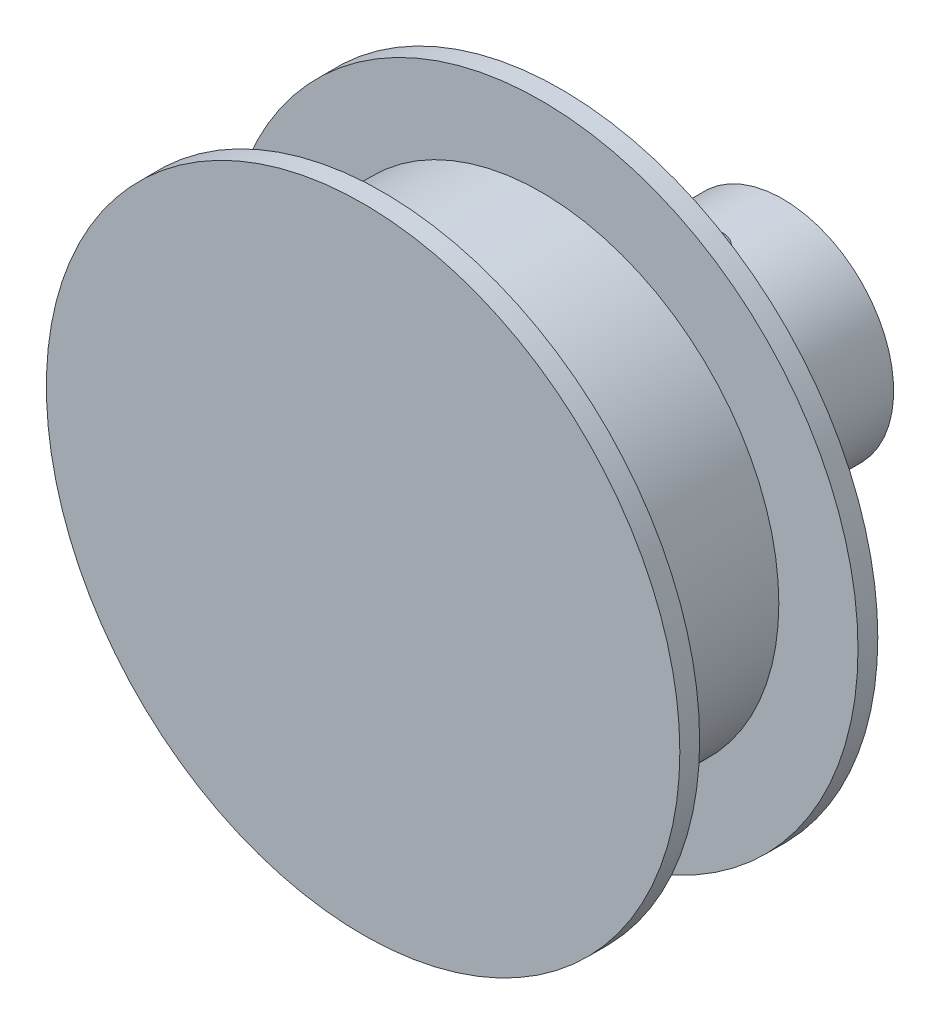
ISO-10303-21;
HEADER;
FILE_DESCRIPTION(('STEP AP214'),'2;1');
FILE_NAME('part.step','',(''),(''),'','','');
FILE_SCHEMA(('AUTOMOTIVE_DESIGN { 1 0 10303 214 1 1 1 1 }'));
ENDSEC;
DATA;
#1=APPLICATION_CONTEXT('core data for automotive mechanical design processes');
#2=APPLICATION_PROTOCOL_DEFINITION('international standard','automotive_design',2000,#1);
#3=PRODUCT_CONTEXT('',#1,'mechanical');
#4=PRODUCT('Part','Part','',(#3));
#5=PRODUCT_RELATED_PRODUCT_CATEGORY('part','',(#4));
#6=PRODUCT_DEFINITION_FORMATION('','',#4);
#7=PRODUCT_DEFINITION_CONTEXT('part definition',#1,'design');
#8=PRODUCT_DEFINITION('design','',#6,#7);
#9=PRODUCT_DEFINITION_SHAPE('','',#8);
#10=(LENGTH_UNIT() NAMED_UNIT(*) SI_UNIT(.MILLI.,.METRE.));
#11=(NAMED_UNIT(*) PLANE_ANGLE_UNIT() SI_UNIT($,.RADIAN.));
#12=(NAMED_UNIT(*) SI_UNIT($,.STERADIAN.) SOLID_ANGLE_UNIT());
#13=UNCERTAINTY_MEASURE_WITH_UNIT(LENGTH_MEASURE(1.E-05),#10,'distance_accuracy_value','');
#14=(GEOMETRIC_REPRESENTATION_CONTEXT(3) GLOBAL_UNCERTAINTY_ASSIGNED_CONTEXT((#13)) GLOBAL_UNIT_ASSIGNED_CONTEXT((#10,
#11,#12)) REPRESENTATION_CONTEXT('',''));
#15=CARTESIAN_POINT('',(0.,0.,0.));
#16=DIRECTION('',(0.,0.,1.));
#17=DIRECTION('',(1.,0.,0.));
#18=AXIS2_PLACEMENT_3D('',#15,#16,#17);
#19=CARTESIAN_POINT('',(0.,0.,-8.89));
#20=DIRECTION('',(0.,0.,1.));
#21=DIRECTION('',(1.,0.,0.));
#22=AXIS2_PLACEMENT_3D('',#19,#20,#21);
#23=CYLINDRICAL_SURFACE('',#22,4.445);
#24=CARTESIAN_POINT('',(0.,0.,-8.89));
#25=DIRECTION('',(0.,0.,-1.));
#26=DIRECTION('',(-1.,0.,0.));
#27=AXIS2_PLACEMENT_3D('',#24,#25,#26);
#28=CIRCLE('',#27,4.445);
#29=CARTESIAN_POINT('',(-4.445,0.,-8.89));
#30=VERTEX_POINT('',#29);
#31=EDGE_CURVE('E67',#30,#30,#28,.T.);
#32=ORIENTED_EDGE('',*,*,#31,.F.);
#33=EDGE_LOOP('',(#32));
#34=FACE_BOUND('',#33,.T.);
#35=CARTESIAN_POINT('',(0.,0.,0.));
#36=DIRECTION('',(0.,0.,-1.));
#37=DIRECTION('',(-1.,0.,0.));
#38=AXIS2_PLACEMENT_3D('',#35,#36,#37);
#39=CIRCLE('',#38,4.445);
#40=CARTESIAN_POINT('',(-4.445,0.,0.));
#41=VERTEX_POINT('',#40);
#42=EDGE_CURVE('E10',#41,#41,#39,.T.);
#43=ORIENTED_EDGE('',*,*,#42,.T.);
#44=EDGE_LOOP('',(#43));
#45=FACE_BOUND('',#44,.T.);
#46=CARTESIAN_POINT('',(0.,-4.445,-6.5024));
#47=CARTESIAN_POINT('',(0.043860784437337,-4.44499922419404,-6.50239827985609));
#48=CARTESIAN_POINT('',(0.0877444679366596,-4.44434407597419,-6.4987228312152));
#49=CARTESIAN_POINT('',(0.174278189480176,-4.44179367534173,-6.48412589665578));
#50=CARTESIAN_POINT('',(0.216927103954973,-4.43989732838557,-6.47319801510449));
#51=CARTESIAN_POINT('',(0.299727047662896,-4.4350769525841,-6.44443887937645));
#52=CARTESIAN_POINT('',(0.339880190238068,-4.43215380754623,-6.42661356077203));
#53=CARTESIAN_POINT('',(0.416621349264358,-4.42560016399602,-6.38458174064237));
#54=CARTESIAN_POINT('',(0.453209714375536,-4.42196973476541,-6.36037586403998));
#55=CARTESIAN_POINT('',(0.522180215516495,-4.4143595161333,-6.30599370007167));
#56=CARTESIAN_POINT('',(0.554518503767721,-4.41037670198772,-6.27576221993163));
#57=CARTESIAN_POINT('',(0.613691844178732,-4.40253340674175,-6.21030578118043));
#58=CARTESIAN_POINT('',(0.640526526203066,-4.39867293388397,-6.17508048698826));
#59=CARTESIAN_POINT('',(0.688109914213216,-4.39148208563801,-6.10033085720609));
#60=CARTESIAN_POINT('',(0.708814648600973,-4.3881556150554,-6.06077812205337));
#61=CARTESIAN_POINT('',(0.743269076192993,-4.3824517104805,-5.97868713228751));
#62=CARTESIAN_POINT('',(0.757019302200786,-4.3800742037885,-5.93614910666991));
#63=CARTESIAN_POINT('',(0.777034972321156,-4.37656770234049,-5.84976202912438));
#64=CARTESIAN_POINT('',(0.783376501559443,-4.37542602508096,-5.80593113067987));
#65=CARTESIAN_POINT('',(0.788630797019795,-4.37448214923508,-5.71781369991042));
#66=CARTESIAN_POINT('',(0.787544157269151,-4.37467984353977,-5.67352720430219));
#67=CARTESIAN_POINT('',(0.778034797553479,-4.37638080995529,-5.58630277668901));
#68=CARTESIAN_POINT('',(0.769698056646965,-4.37786878006914,-5.54335512894592));
#69=CARTESIAN_POINT('',(0.746060306038914,-4.38195864911965,-5.45947789437466));
#70=CARTESIAN_POINT('',(0.730759029420811,-4.38456059074916,-5.4185483849585));
#71=CARTESIAN_POINT('',(0.693540898768382,-4.39060149921825,-5.33961472176041));
#72=CARTESIAN_POINT('',(0.671588824862036,-4.39404490283999,-5.3016275280967));
#73=CARTESIAN_POINT('',(0.621717195694813,-4.40137774408315,-5.22984335314436));
#74=CARTESIAN_POINT('',(0.593797097996176,-4.4052672222337,-5.19604675318314));
#75=CARTESIAN_POINT('',(0.532315903757191,-4.41312093158066,-5.13310588353736));
#76=CARTESIAN_POINT('',(0.498681148128465,-4.41708544587114,-5.10403355208049));
#77=CARTESIAN_POINT('',(0.426973228116419,-4.42459222165068,-5.05193386759074));
#78=CARTESIAN_POINT('',(0.388900027829352,-4.42813447972354,-5.02890656346258));
#79=CARTESIAN_POINT('',(0.309324724750202,-4.43440365517576,-4.9895420784749));
#80=CARTESIAN_POINT('',(0.267819135656451,-4.4371297302425,-4.97321180266467));
#81=CARTESIAN_POINT('',(0.182595119635691,-4.44145275793028,-4.94777459941377));
#82=CARTESIAN_POINT('',(0.1388769025818,-4.44304981742688,-4.93866698824679));
#83=CARTESIAN_POINT('',(0.0510881145359754,-4.44492034664658,-4.92803244070224));
#84=CARTESIAN_POINT('',(0.00702984994213987,-4.44521104166531,-4.92640684198202));
#85=CARTESIAN_POINT('',(-0.0807291985336589,-4.44448346411101,-4.93051863784099));
#86=CARTESIAN_POINT('',(-0.124429997938574,-4.44346524868446,-4.93625571096899));
#87=CARTESIAN_POINT('',(-0.209924854488727,-4.44024495039647,-4.95484794416592));
#88=CARTESIAN_POINT('',(-0.251729984864177,-4.43805108222015,-4.96765373117759));
#89=CARTESIAN_POINT('',(-0.332599980273892,-4.43272444714496,-4.99996686118535));
#90=CARTESIAN_POINT('',(-0.371664675103964,-4.42959162199253,-5.01947461998754));
#91=CARTESIAN_POINT('',(-0.446369804483423,-4.42269168576044,-5.06486018569718));
#92=CARTESIAN_POINT('',(-0.481972634164526,-4.41891861921531,-5.09079896724435));
#93=CARTESIAN_POINT('',(-0.548355496344193,-4.41117333639321,-5.14822706850107));
#94=CARTESIAN_POINT('',(-0.579135129586692,-4.4072011036655,-5.17971684725482));
#95=CARTESIAN_POINT('',(-0.635368107794538,-4.39944877276715,-5.24779764789606));
#96=CARTESIAN_POINT('',(-0.660754456642331,-4.39567148827441,-5.28444437909867));
#97=CARTESIAN_POINT('',(-0.705010813945073,-4.38879122878618,-5.36154014549702));
#98=CARTESIAN_POINT('',(-0.723881047410447,-4.38568823050803,-5.40198904933713));
#99=CARTESIAN_POINT('',(-0.754471848169014,-4.38052946619188,-5.48536207847031));
#100=CARTESIAN_POINT('',(-0.766224469718678,-4.378469012055,-5.52827413917339));
#101=CARTESIAN_POINT('',(-0.782346375616618,-4.37561736758105,-5.61550326028159));
#102=CARTESIAN_POINT('',(-0.786716394172981,-4.37482605102723,-5.65982018052523));
#103=CARTESIAN_POINT('',(-0.787926555435724,-4.37460819292187,-5.74793104941419));
#104=CARTESIAN_POINT('',(-0.784872255092845,-4.37516251923527,-5.79172353628641));
#105=CARTESIAN_POINT('',(-0.771550121146633,-4.37753131700356,-5.87816065815361));
#106=CARTESIAN_POINT('',(-0.761282320096387,-4.37934578277171,-5.92080529832769));
#107=CARTESIAN_POINT('',(-0.733867121047589,-4.38402275642772,-6.00368756518297));
#108=CARTESIAN_POINT('',(-0.71672996052775,-4.38688370417992,-6.04392867178754));
#109=CARTESIAN_POINT('',(-0.676073665698779,-4.39333258364465,-6.12098159403416));
#110=CARTESIAN_POINT('',(-0.652554148383913,-4.39692055898288,-6.15779320369369));
#111=CARTESIAN_POINT('',(-0.599428792194555,-4.40447926094636,-6.22747330131512));
#112=CARTESIAN_POINT('',(-0.569745694264005,-4.40845446826882,-6.26028240884544));
#113=CARTESIAN_POINT('',(-0.505297899755232,-4.41630509049343,-6.32048964112623));
#114=CARTESIAN_POINT('',(-0.470532035549621,-4.42018048222441,-6.34788651915475));
#115=CARTESIAN_POINT('',(-0.396577276437706,-4.42743057989394,-6.39669197195212));
#116=CARTESIAN_POINT('',(-0.357355570826316,-4.43080108296587,-6.41805146545907));
#117=CARTESIAN_POINT('',(-0.275835160128162,-4.43662072451051,-6.45384469723661));
#118=CARTESIAN_POINT('',(-0.233539480831493,-4.43907075475321,-6.46828514255577));
#119=CARTESIAN_POINT('',(-0.15924864208945,-4.44225581772837,-6.48679431048301));
#120=CARTESIAN_POINT('',(-0.127695844332841,-4.44327923493744,-6.49263676818564));
#121=CARTESIAN_POINT('',(-0.0640994346667007,-4.44465160249508,-6.50044020079436));
#122=CARTESIAN_POINT('',(-0.0320558330737686,-4.44500056700095,-6.50240125717419));
#123=CARTESIAN_POINT('',(0.,-4.445,-6.5024));
#124=B_SPLINE_CURVE_WITH_KNOTS('',3,(#46,#47,#48,#49,#50,#51,#52,#53,#54,#55,#56,#57,#58,#59,
#60,#61,#62,#63,#64,#65,#66,#67,#68,#69,#70,#71,#72,#73,#74,#75,#76,#77,#78,#79,#80,#81,#82,#83,
#84,#85,#86,#87,#88,#89,#90,#91,#92,#93,#94,#95,#96,#97,#98,#99,#100,#101,#102,#103,#104,#105,
#106,#107,#108,#109,#110,#111,#112,#113,#114,#115,#116,#117,#118,#119,#120,#121,#122,#123),
.UNSPECIFIED.,.T.,.F.,(4,2,2,2,2,2,2,2,2,2,2,2,2,2,2,2,2,2,2,2,2,2,2,2,2,2,2,2,2,2,2,2,2,2,2,2,
2,2,4),(0.,0.131465152607735,0.263046393440639,0.394514653285584,0.525970041683568,
0.658689972193368,0.791418825626128,0.925077908002101,1.05872674884576,1.19099064258835,
1.32324395937132,1.45394994522678,1.58466094082481,1.71607659926538,1.84750420724775,
1.98077606091097,2.11404899272011,2.24745899374045,2.38085636412893,2.51248953892863,
2.64411696687428,2.77483643778693,2.90556402030791,3.0375819419581,3.16961078606284,
3.30319451979799,3.43677364024175,3.56974662315158,3.70270638097156,3.83378683739291,
3.96486670227814,4.0957519394679,4.2266450328287,4.35929030672073,4.49196610027862,
4.62569135135828,4.75928671095311,4.85537057046143,4.95145241307033),.UNSPECIFIED.);
#125=CARTESIAN_POINT('',(0.,-4.445,-6.5024));
#126=VERTEX_POINT('',#125);
#127=EDGE_CURVE('E108',#126,#126,#124,.T.);
#128=ORIENTED_EDGE('',*,*,#127,.F.);
#129=EDGE_LOOP('',(#128));
#130=FACE_BOUND('',#129,.T.);
#131=CARTESIAN_POINT('',(0.,4.445,-6.5024));
#132=CARTESIAN_POINT('',(-0.043860784437337,4.44499922419404,-6.50239827985609));
#133=CARTESIAN_POINT('',(-0.0877444679366596,4.44434407597419,-6.4987228312152));
#134=CARTESIAN_POINT('',(-0.174278189480176,4.44179367534173,-6.48412589665578));
#135=CARTESIAN_POINT('',(-0.216927103954973,4.43989732838557,-6.47319801510449));
#136=CARTESIAN_POINT('',(-0.299727047662896,4.4350769525841,-6.44443887937645));
#137=CARTESIAN_POINT('',(-0.339880190238068,4.43215380754623,-6.42661356077203));
#138=CARTESIAN_POINT('',(-0.416621349264358,4.42560016399602,-6.38458174064237));
#139=CARTESIAN_POINT('',(-0.453209714375536,4.42196973476541,-6.36037586403998));
#140=CARTESIAN_POINT('',(-0.522180215516495,4.4143595161333,-6.30599370007167));
#141=CARTESIAN_POINT('',(-0.554518503767721,4.41037670198772,-6.27576221993163));
#142=CARTESIAN_POINT('',(-0.613691844178732,4.40253340674175,-6.21030578118043));
#143=CARTESIAN_POINT('',(-0.640526526203066,4.39867293388397,-6.17508048698826));
#144=CARTESIAN_POINT('',(-0.688109914213216,4.39148208563801,-6.10033085720609));
#145=CARTESIAN_POINT('',(-0.708814648600973,4.3881556150554,-6.06077812205337));
#146=CARTESIAN_POINT('',(-0.743269076192993,4.3824517104805,-5.97868713228751));
#147=CARTESIAN_POINT('',(-0.757019302200786,4.3800742037885,-5.93614910666991));
#148=CARTESIAN_POINT('',(-0.777034972321156,4.37656770234049,-5.84976202912438));
#149=CARTESIAN_POINT('',(-0.783376501559443,4.37542602508096,-5.80593113067987));
#150=CARTESIAN_POINT('',(-0.788630797019795,4.37448214923508,-5.71781369991042));
#151=CARTESIAN_POINT('',(-0.787544157269151,4.37467984353977,-5.67352720430219));
#152=CARTESIAN_POINT('',(-0.778034797553479,4.37638080995529,-5.58630277668901));
#153=CARTESIAN_POINT('',(-0.769698056646965,4.37786878006914,-5.54335512894592));
#154=CARTESIAN_POINT('',(-0.746060306038914,4.38195864911965,-5.45947789437466));
#155=CARTESIAN_POINT('',(-0.730759029420811,4.38456059074916,-5.4185483849585));
#156=CARTESIAN_POINT('',(-0.693540898768382,4.39060149921825,-5.33961472176041));
#157=CARTESIAN_POINT('',(-0.671588824862036,4.39404490283999,-5.3016275280967));
#158=CARTESIAN_POINT('',(-0.621717195694813,4.40137774408315,-5.22984335314436));
#159=CARTESIAN_POINT('',(-0.593797097996176,4.4052672222337,-5.19604675318314));
#160=CARTESIAN_POINT('',(-0.532315903757191,4.41312093158066,-5.13310588353736));
#161=CARTESIAN_POINT('',(-0.498681148128465,4.41708544587114,-5.10403355208049));
#162=CARTESIAN_POINT('',(-0.426973228116419,4.42459222165068,-5.05193386759074));
#163=CARTESIAN_POINT('',(-0.388900027829352,4.42813447972354,-5.02890656346258));
#164=CARTESIAN_POINT('',(-0.309324724750202,4.43440365517576,-4.9895420784749));
#165=CARTESIAN_POINT('',(-0.267819135656451,4.4371297302425,-4.97321180266467));
#166=CARTESIAN_POINT('',(-0.182595119635691,4.44145275793028,-4.94777459941377));
#167=CARTESIAN_POINT('',(-0.1388769025818,4.44304981742688,-4.93866698824679));
#168=CARTESIAN_POINT('',(-0.0510881145359754,4.44492034664658,-4.92803244070224));
#169=CARTESIAN_POINT('',(-0.00702984994213987,4.44521104166531,-4.92640684198202));
#170=CARTESIAN_POINT('',(0.0807291985336589,4.44448346411101,-4.93051863784099));
#171=CARTESIAN_POINT('',(0.124429997938574,4.44346524868446,-4.93625571096899));
#172=CARTESIAN_POINT('',(0.209924854488727,4.44024495039647,-4.95484794416592));
#173=CARTESIAN_POINT('',(0.251729984864177,4.43805108222015,-4.96765373117759));
#174=CARTESIAN_POINT('',(0.332599980273892,4.43272444714496,-4.99996686118535));
#175=CARTESIAN_POINT('',(0.371664675103964,4.42959162199253,-5.01947461998754));
#176=CARTESIAN_POINT('',(0.446369804483423,4.42269168576044,-5.06486018569718));
#177=CARTESIAN_POINT('',(0.481972634164526,4.41891861921531,-5.09079896724435));
#178=CARTESIAN_POINT('',(0.548355496344193,4.41117333639321,-5.14822706850107));
#179=CARTESIAN_POINT('',(0.579135129586692,4.4072011036655,-5.17971684725482));
#180=CARTESIAN_POINT('',(0.635368107794538,4.39944877276715,-5.24779764789606));
#181=CARTESIAN_POINT('',(0.660754456642331,4.39567148827441,-5.28444437909867));
#182=CARTESIAN_POINT('',(0.705010813945073,4.38879122878618,-5.36154014549702));
#183=CARTESIAN_POINT('',(0.723881047410447,4.38568823050803,-5.40198904933713));
#184=CARTESIAN_POINT('',(0.754471848169014,4.38052946619188,-5.48536207847031));
#185=CARTESIAN_POINT('',(0.766224469718678,4.378469012055,-5.52827413917339));
#186=CARTESIAN_POINT('',(0.782346375616618,4.37561736758105,-5.61550326028159));
#187=CARTESIAN_POINT('',(0.786716394172981,4.37482605102723,-5.65982018052523));
#188=CARTESIAN_POINT('',(0.787926555435724,4.37460819292187,-5.74793104941419));
#189=CARTESIAN_POINT('',(0.784872255092845,4.37516251923527,-5.79172353628641));
#190=CARTESIAN_POINT('',(0.771550121146633,4.37753131700356,-5.87816065815361));
#191=CARTESIAN_POINT('',(0.761282320096387,4.37934578277171,-5.92080529832769));
#192=CARTESIAN_POINT('',(0.733867121047589,4.38402275642772,-6.00368756518297));
#193=CARTESIAN_POINT('',(0.71672996052775,4.38688370417992,-6.04392867178754));
#194=CARTESIAN_POINT('',(0.676073665698779,4.39333258364465,-6.12098159403416));
#195=CARTESIAN_POINT('',(0.652554148383913,4.39692055898288,-6.15779320369369));
#196=CARTESIAN_POINT('',(0.599428792194555,4.40447926094636,-6.22747330131512));
#197=CARTESIAN_POINT('',(0.569745694264005,4.40845446826882,-6.26028240884544));
#198=CARTESIAN_POINT('',(0.505297899755232,4.41630509049343,-6.32048964112623));
#199=CARTESIAN_POINT('',(0.470532035549621,4.42018048222441,-6.34788651915475));
#200=CARTESIAN_POINT('',(0.396577276437706,4.42743057989394,-6.39669197195212));
#201=CARTESIAN_POINT('',(0.357355570826316,4.43080108296587,-6.41805146545907));
#202=CARTESIAN_POINT('',(0.275835160128162,4.43662072451051,-6.45384469723661));
#203=CARTESIAN_POINT('',(0.233539480831493,4.43907075475321,-6.46828514255577));
#204=CARTESIAN_POINT('',(0.15924864208945,4.44225581772837,-6.48679431048301));
#205=CARTESIAN_POINT('',(0.127695844332841,4.44327923493744,-6.49263676818564));
#206=CARTESIAN_POINT('',(0.0640994346667007,4.44465160249508,-6.50044020079436));
#207=CARTESIAN_POINT('',(0.0320558330737686,4.44500056700095,-6.50240125717419));
#208=CARTESIAN_POINT('',(0.,4.445,-6.5024));
#209=B_SPLINE_CURVE_WITH_KNOTS('',3,(#131,#132,#133,#134,#135,#136,#137,#138,#139,#140,#141,
#142,#143,#144,#145,#146,#147,#148,#149,#150,#151,#152,#153,#154,#155,#156,#157,#158,#159,#160,
#161,#162,#163,#164,#165,#166,#167,#168,#169,#170,#171,#172,#173,#174,#175,#176,#177,#178,#179,
#180,#181,#182,#183,#184,#185,#186,#187,#188,#189,#190,#191,#192,#193,#194,#195,#196,#197,#198,
#199,#200,#201,#202,#203,#204,#205,#206,#207,#208),.UNSPECIFIED.,.T.,.F.,(4,2,2,2,2,2,2,2,2,2,2,
2,2,2,2,2,2,2,2,2,2,2,2,2,2,2,2,2,2,2,2,2,2,2,2,2,2,2,4),(0.,0.131465152607735,
0.263046393440639,0.394514653285584,0.525970041683568,0.658689972193368,0.791418825626128,
0.925077908002101,1.05872674884576,1.19099064258835,1.32324395937132,1.45394994522678,
1.58466094082481,1.71607659926538,1.84750420724775,1.98077606091097,2.11404899272011,
2.24745899374045,2.38085636412893,2.51248953892863,2.64411696687428,2.77483643778693,
2.90556402030791,3.0375819419581,3.16961078606284,3.30319451979799,3.43677364024175,
3.56974662315158,3.70270638097156,3.83378683739291,3.96486670227814,4.0957519394679,
4.2266450328287,4.35929030672073,4.49196610027862,4.62569135135828,4.75928671095311,
4.85537057046143,4.95145241307033),.UNSPECIFIED.);
#210=CARTESIAN_POINT('',(0.,4.445,-6.5024));
#211=VERTEX_POINT('',#210);
#212=EDGE_CURVE('E115',#211,#211,#209,.T.);
#213=ORIENTED_EDGE('',*,*,#212,.F.);
#214=EDGE_LOOP('',(#213));
#215=FACE_BOUND('',#214,.T.);
#216=ADVANCED_FACE('F41',(#34,#45,#130,#215),#23,.T.);
#217=CARTESIAN_POINT('',(0.,0.,0.635000000000002));
#218=DIRECTION('',(0.,0.,-1.));
#219=DIRECTION('',(-1.,0.,0.));
#220=AXIS2_PLACEMENT_3D('',#217,#218,#219);
#221=CYLINDRICAL_SURFACE('',#220,3.175);
#222=CARTESIAN_POINT('',(0.,0.,0.635000000000002));
#223=DIRECTION('',(0.,0.,-1.));
#224=DIRECTION('',(-1.,0.,0.));
#225=AXIS2_PLACEMENT_3D('',#222,#223,#224);
#226=CIRCLE('',#225,3.175);
#227=CARTESIAN_POINT('',(-3.175,0.,0.635000000000002));
#228=VERTEX_POINT('',#227);
#229=EDGE_CURVE('E166',#228,#228,#226,.T.);
#230=ORIENTED_EDGE('',*,*,#229,.F.);
#231=EDGE_LOOP('',(#230));
#232=FACE_BOUND('',#231,.T.);
#233=CARTESIAN_POINT('',(0.,0.,-8.89));
#234=DIRECTION('',(0.,0.,-1.));
#235=DIRECTION('',(-1.,0.,0.));
#236=AXIS2_PLACEMENT_3D('',#233,#234,#235);
#237=CIRCLE('',#236,3.175);
#238=CARTESIAN_POINT('',(-3.175,0.,-8.89));
#239=VERTEX_POINT('',#238);
#240=EDGE_CURVE('E170',#239,#239,#237,.T.);
#241=ORIENTED_EDGE('',*,*,#240,.T.);
#242=EDGE_LOOP('',(#241));
#243=FACE_BOUND('',#242,.T.);
#244=CARTESIAN_POINT('',(0.,-3.17500000000001,-6.5024));
#245=CARTESIAN_POINT('',(-0.0435157027577026,-3.17499925690709,-6.50239875865));
#246=CARTESIAN_POINT('',(-0.0870453427836385,-3.17409645278716,-6.49878051482417));
#247=CARTESIAN_POINT('',(-0.172857810715069,-3.17058244807221,-6.4844243631617));
#248=CARTESIAN_POINT('',(-0.215139904836806,-3.1679702621898,-6.473682349137));
#249=CARTESIAN_POINT('',(-0.297205617056288,-3.1613268604182,-6.44544394132673));
#250=CARTESIAN_POINT('',(-0.336992144190274,-3.15729733433317,-6.42795558837888));
#251=CARTESIAN_POINT('',(-0.413066610264011,-3.14824878516177,-6.38674903893734));
#252=CARTESIAN_POINT('',(-0.449354444826038,-3.14322973256809,-6.36303065665957));
#253=CARTESIAN_POINT('',(-0.518137878204066,-3.13263347939435,-6.3095289031618));
#254=CARTESIAN_POINT('',(-0.550552368516792,-3.12704777790572,-6.27964293459191));
#255=CARTESIAN_POINT('',(-0.609964155162396,-3.11600447233534,-6.21487406308002));
#256=CARTESIAN_POINT('',(-0.636960849243902,-3.11054688255419,-6.17999060534656));
#257=CARTESIAN_POINT('',(-0.685150562596801,-3.10029215916708,-6.1055892281724));
#258=CARTESIAN_POINT('',(-0.706253147946937,-3.09550582480245,-6.06601111116231));
#259=CARTESIAN_POINT('',(-0.741474153359047,-3.08725938694275,-5.98373133639849));
#260=CARTESIAN_POINT('',(-0.755593670475552,-3.08379907514603,-5.94103017049297));
#261=CARTESIAN_POINT('',(-0.776171622658986,-3.07868379192836,-5.85460750984069));
#262=CARTESIAN_POINT('',(-0.782775746045068,-3.076994540744,-5.81092278059141));
#263=CARTESIAN_POINT('',(-0.788589188723862,-3.07551001036468,-5.72303529741268));
#264=CARTESIAN_POINT('',(-0.787799690708084,-3.07571442825637,-5.67883262746334));
#265=CARTESIAN_POINT('',(-0.778964607375296,-3.07796331021238,-5.59227828247115));
#266=CARTESIAN_POINT('',(-0.771092325057575,-3.07996382457619,-5.54990759751443));
#267=CARTESIAN_POINT('',(-0.748591466456015,-3.0855094887586,-5.4671078823553));
#268=CARTESIAN_POINT('',(-0.733962415692185,-3.08905474705263,-5.42667898873129));
#269=CARTESIAN_POINT('',(-0.698214833784896,-3.09733097673815,-5.34844426457661));
#270=CARTESIAN_POINT('',(-0.677033155667529,-3.10207339947555,-5.31066854988673));
#271=CARTESIAN_POINT('',(-0.628825767719242,-3.11220310485588,-5.23914538316945));
#272=CARTESIAN_POINT('',(-0.601799050280862,-3.11759049861172,-5.20539862723992));
#273=CARTESIAN_POINT('',(-0.541769748462413,-3.12858841322431,-5.14189786650285));
#274=CARTESIAN_POINT('',(-0.508620839641973,-3.13420095458303,-5.11228236560763));
#275=CARTESIAN_POINT('',(-0.437760013679802,-3.14488044962768,-5.05900467248765));
#276=CARTESIAN_POINT('',(-0.400047961543512,-3.14994738716425,-5.03534265645266));
#277=CARTESIAN_POINT('',(-0.320935676033402,-3.15898933768709,-4.99459389749715));
#278=CARTESIAN_POINT('',(-0.279523556741128,-3.16296065102112,-4.97752935662367));
#279=CARTESIAN_POINT('',(-0.194298132271528,-3.16933695792992,-4.95064240840583));
#280=CARTESIAN_POINT('',(-0.150485280545736,-3.17174224619823,-4.94081863845214));
#281=CARTESIAN_POINT('',(-0.0628865207954511,-3.17467199470195,-4.92890293265345));
#282=CARTESIAN_POINT('',(-0.0191277713454387,-3.17524233615991,-4.92662234450323));
#283=CARTESIAN_POINT('',(0.068146080330493,-3.17456846460086,-4.92934072916937));
#284=CARTESIAN_POINT('',(0.111661203774426,-3.17332441215179,-4.93433905782527));
#285=CARTESIAN_POINT('',(0.196559074305341,-3.16919090896436,-4.95131781775668));
#286=CARTESIAN_POINT('',(0.23796363549524,-3.16632566269804,-4.96319559891563));
#287=CARTESIAN_POINT('',(0.318190583963889,-3.15927252915412,-4.99347907235269));
#288=CARTESIAN_POINT('',(0.357012712433868,-3.15508450955057,-5.01188541774987));
#289=CARTESIAN_POINT('',(0.431725369007893,-3.14574025536124,-5.0550709862634));
#290=CARTESIAN_POINT('',(0.467552610775384,-3.14056834158804,-5.07995622334602));
#291=CARTESIAN_POINT('',(0.534589640476678,-3.1298551615944,-5.1352573968889));
#292=CARTESIAN_POINT('',(0.565798643279393,-3.12431383280271,-5.16567427180937));
#293=CARTESIAN_POINT('',(0.623488616449639,-3.11332164785909,-5.23205060407304));
#294=CARTESIAN_POINT('',(0.649837354451587,-3.10787619975532,-5.26812607603337));
#295=CARTESIAN_POINT('',(0.696106524703096,-3.09784173414627,-5.34429816955657));
#296=CARTESIAN_POINT('',(0.716027243218309,-3.09325267850622,-5.38439461194514));
#297=CARTESIAN_POINT('',(0.748727120529248,-3.08550080753115,-5.46725448136998));
#298=CARTESIAN_POINT('',(0.761548595796957,-3.08232956335793,-5.5100003789531));
#299=CARTESIAN_POINT('',(0.779798610770156,-3.07776368240648,-5.5971314912926));
#300=CARTESIAN_POINT('',(0.785228736603381,-3.07636866446767,-5.64151635223933));
#301=CARTESIAN_POINT('',(0.78846003562707,-3.07554190679648,-5.72932076289236));
#302=CARTESIAN_POINT('',(0.786472429831575,-3.07605580832572,-5.77273215301986));
#303=CARTESIAN_POINT('',(0.77540734172075,-3.07886349136826,-5.8585800900773));
#304=CARTESIAN_POINT('',(0.766329997516506,-3.08115723820942,-5.90101665598066));
#305=CARTESIAN_POINT('',(0.741457611033751,-3.08723611444755,-5.98348485467238));
#306=CARTESIAN_POINT('',(0.725701587674217,-3.09101257208197,-6.02352893861969));
#307=CARTESIAN_POINT('',(0.687950081395993,-3.09963270606889,-6.10043359546044));
#308=CARTESIAN_POINT('',(0.665953746817077,-3.10447652807212,-6.13729373292144));
#309=CARTESIAN_POINT('',(0.615681235152745,-3.11484112768685,-6.20780627078584));
#310=CARTESIAN_POINT('',(0.587258223067723,-3.12037610138478,-6.24135191492632));
#311=CARTESIAN_POINT('',(0.525226114983883,-3.13141393001476,-6.30326624289251));
#312=CARTESIAN_POINT('',(0.491615792157104,-3.13691677702831,-6.3316336985745));
#313=CARTESIAN_POINT('',(0.419443381045281,-3.1473868070515,-6.38287664641011));
#314=CARTESIAN_POINT('',(0.380804013113036,-3.15234275311446,-6.40564576163218));
#315=CARTESIAN_POINT('',(0.300126883614157,-3.16104248168893,-6.44432894149441));
#316=CARTESIAN_POINT('',(0.258091612414851,-3.16478714258439,-6.46024797636579));
#317=CARTESIAN_POINT('',(0.180102313295466,-3.17008088719743,-6.48238347123021));
#318=CARTESIAN_POINT('',(0.144523567184693,-3.17191297031563,-6.48987357906242));
#319=CARTESIAN_POINT('',(0.0726330816331684,-3.17437279302113,-6.49988218063372));
#320=CARTESIAN_POINT('',(0.0363213957213732,-3.17500062023983,-6.50240103612171));
#321=CARTESIAN_POINT('',(0.,-3.17500000000001,-6.5024));
#322=B_SPLINE_CURVE_WITH_KNOTS('',3,(#244,#245,#246,#247,#248,#249,#250,#251,#252,#253,#254,
#255,#256,#257,#258,#259,#260,#261,#262,#263,#264,#265,#266,#267,#268,#269,#270,#271,#272,#273,
#274,#275,#276,#277,#278,#279,#280,#281,#282,#283,#284,#285,#286,#287,#288,#289,#290,#291,#292,
#293,#294,#295,#296,#297,#298,#299,#300,#301,#302,#303,#304,#305,#306,#307,#308,#309,#310,#311,
#312,#313,#314,#315,#316,#317,#318,#319,#320,#321),.UNSPECIFIED.,.T.,.F.,(4,2,2,2,2,2,2,2,2,2,2,
2,2,2,2,2,2,2,2,2,2,2,2,2,2,2,2,2,2,2,2,2,2,2,2,2,2,2,4),(0.,0.130414014392739,
0.260903265694998,0.391237467399482,0.521575556207547,0.654287578101808,0.787014344326696,
0.92167782706154,1.05632014715779,1.18830537694925,1.32026949460425,1.44908995477645,
1.57791946247285,1.7080313424875,1.83816566997308,1.97194927505577,2.10573683891756,
2.23997078969988,2.3741794731223,2.50500519691103,2.63581934375256,2.76473010135629,
2.89365375886061,3.02483640606654,3.15604132962894,3.29041166575394,3.42477601699939,
3.55833059506305,3.69185650880284,3.82160964655399,3.95136025672251,4.08036305047563,
4.20938345864594,4.34171897487025,4.47408583728055,4.60880133685158,4.74341892503984,
4.85227994420271,4.96113304145697),.UNSPECIFIED.);
#323=CARTESIAN_POINT('',(0.,-3.17500000000001,-6.5024));
#324=VERTEX_POINT('',#323);
#325=EDGE_CURVE('E87',#324,#324,#322,.T.);
#326=ORIENTED_EDGE('',*,*,#325,.F.);
#327=EDGE_LOOP('',(#326));
#328=FACE_BOUND('',#327,.T.);
#329=CARTESIAN_POINT('',(0.,3.17499999999999,-6.5024));
#330=CARTESIAN_POINT('',(0.0435157027577029,3.17499925690708,-6.50239875865));
#331=CARTESIAN_POINT('',(0.0870453427836391,3.17409645278715,-6.49878051482417));
#332=CARTESIAN_POINT('',(0.17285781071507,3.17058244807222,-6.4844243631617));
#333=CARTESIAN_POINT('',(0.215139904836807,3.16797026218981,-6.473682349137));
#334=CARTESIAN_POINT('',(0.297205617056288,3.1613268604182,-6.44544394132673));
#335=CARTESIAN_POINT('',(0.336992144190275,3.15729733433317,-6.42795558837888));
#336=CARTESIAN_POINT('',(0.413066610264011,3.14824878516177,-6.38674903893734));
#337=CARTESIAN_POINT('',(0.449354444826039,3.14322973256809,-6.36303065665957));
#338=CARTESIAN_POINT('',(0.518137878204067,3.13263347939435,-6.3095289031618));
#339=CARTESIAN_POINT('',(0.550552368516793,3.12704777790572,-6.27964293459191));
#340=CARTESIAN_POINT('',(0.609964155162396,3.11600447233534,-6.21487406308002));
#341=CARTESIAN_POINT('',(0.636960849243902,3.11054688255419,-6.17999060534656));
#342=CARTESIAN_POINT('',(0.685150562596801,3.10029215916708,-6.1055892281724));
#343=CARTESIAN_POINT('',(0.706253147946937,3.09550582480245,-6.06601111116231));
#344=CARTESIAN_POINT('',(0.741474153359047,3.08725938694275,-5.98373133639849));
#345=CARTESIAN_POINT('',(0.755593670475553,3.08379907514603,-5.94103017049296));
#346=CARTESIAN_POINT('',(0.776171622658987,3.07868379192836,-5.85460750984069));
#347=CARTESIAN_POINT('',(0.782775746045068,3.076994540744,-5.81092278059141));
#348=CARTESIAN_POINT('',(0.788589188723862,3.07551001036468,-5.72303529741268));
#349=CARTESIAN_POINT('',(0.787799690708084,3.07571442825637,-5.67883262746334));
#350=CARTESIAN_POINT('',(0.778964607375296,3.07796331021238,-5.59227828247115));
#351=CARTESIAN_POINT('',(0.771092325057575,3.07996382457619,-5.54990759751443));
#352=CARTESIAN_POINT('',(0.748591466456015,3.0855094887586,-5.4671078823553));
#353=CARTESIAN_POINT('',(0.733962415692184,3.08905474705263,-5.42667898873129));
#354=CARTESIAN_POINT('',(0.698214833784895,3.09733097673815,-5.34844426457661));
#355=CARTESIAN_POINT('',(0.677033155667528,3.10207339947555,-5.31066854988673));
#356=CARTESIAN_POINT('',(0.628825767719241,3.11220310485588,-5.23914538316944));
#357=CARTESIAN_POINT('',(0.601799050280861,3.11759049861172,-5.20539862723992));
#358=CARTESIAN_POINT('',(0.541769748462412,3.12858841322431,-5.14189786650285));
#359=CARTESIAN_POINT('',(0.508620839641973,3.13420095458303,-5.11228236560763));
#360=CARTESIAN_POINT('',(0.437760013679802,3.14488044962768,-5.05900467248765));
#361=CARTESIAN_POINT('',(0.400047961543512,3.14994738716425,-5.03534265645266));
#362=CARTESIAN_POINT('',(0.320935676033402,3.15898933768709,-4.99459389749715));
#363=CARTESIAN_POINT('',(0.279523556741127,3.16296065102112,-4.97752935662367));
#364=CARTESIAN_POINT('',(0.194298132271527,3.16933695792992,-4.95064240840583));
#365=CARTESIAN_POINT('',(0.150485280545735,3.17174224619823,-4.94081863845214));
#366=CARTESIAN_POINT('',(0.06288652079545,3.17467199470195,-4.92890293265345));
#367=CARTESIAN_POINT('',(0.0191277713454378,3.17524233615991,-4.92662234450323));
#368=CARTESIAN_POINT('',(-0.0681460803304938,3.17456846460086,-4.92934072916937));
#369=CARTESIAN_POINT('',(-0.111661203774427,3.17332441215179,-4.93433905782527));
#370=CARTESIAN_POINT('',(-0.196559074305342,3.16919090896436,-4.95131781775668));
#371=CARTESIAN_POINT('',(-0.23796363549524,3.16632566269804,-4.96319559891563));
#372=CARTESIAN_POINT('',(-0.318190583963889,3.15927252915412,-4.99347907235269));
#373=CARTESIAN_POINT('',(-0.357012712433868,3.15508450955057,-5.01188541774987));
#374=CARTESIAN_POINT('',(-0.431725369007893,3.14574025536124,-5.0550709862634));
#375=CARTESIAN_POINT('',(-0.467552610775384,3.14056834158804,-5.07995622334602));
#376=CARTESIAN_POINT('',(-0.534589640476678,3.1298551615944,-5.1352573968889));
#377=CARTESIAN_POINT('',(-0.565798643279393,3.12431383280271,-5.16567427180937));
#378=CARTESIAN_POINT('',(-0.623488616449639,3.11332164785909,-5.23205060407304));
#379=CARTESIAN_POINT('',(-0.649837354451587,3.10787619975532,-5.26812607603337));
#380=CARTESIAN_POINT('',(-0.696106524703096,3.09784173414627,-5.34429816955658));
#381=CARTESIAN_POINT('',(-0.71602724321831,3.09325267850622,-5.38439461194514));
#382=CARTESIAN_POINT('',(-0.748727120529248,3.08550080753115,-5.46725448136998));
#383=CARTESIAN_POINT('',(-0.761548595796956,3.08232956335793,-5.5100003789531));
#384=CARTESIAN_POINT('',(-0.779798610770156,3.07776368240648,-5.5971314912926));
#385=CARTESIAN_POINT('',(-0.785228736603381,3.07636866446767,-5.64151635223933));
#386=CARTESIAN_POINT('',(-0.78846003562707,3.07554190679648,-5.72932076289236));
#387=CARTESIAN_POINT('',(-0.786472429831575,3.07605580832572,-5.77273215301986));
#388=CARTESIAN_POINT('',(-0.77540734172075,3.07886349136826,-5.8585800900773));
#389=CARTESIAN_POINT('',(-0.766329997516505,3.08115723820942,-5.90101665598066));
#390=CARTESIAN_POINT('',(-0.741457611033751,3.08723611444755,-5.98348485467239));
#391=CARTESIAN_POINT('',(-0.725701587674217,3.09101257208197,-6.02352893861969));
#392=CARTESIAN_POINT('',(-0.687950081395993,3.09963270606889,-6.10043359546044));
#393=CARTESIAN_POINT('',(-0.665953746817077,3.10447652807212,-6.13729373292144));
#394=CARTESIAN_POINT('',(-0.615681235152745,3.11484112768685,-6.20780627078584));
#395=CARTESIAN_POINT('',(-0.587258223067723,3.12037610138478,-6.24135191492632));
#396=CARTESIAN_POINT('',(-0.525226114983883,3.13141393001476,-6.30326624289251));
#397=CARTESIAN_POINT('',(-0.491615792157104,3.13691677702831,-6.3316336985745));
#398=CARTESIAN_POINT('',(-0.419443381045281,3.1473868070515,-6.38287664641011));
#399=CARTESIAN_POINT('',(-0.380804013113036,3.15234275311446,-6.40564576163218));
#400=CARTESIAN_POINT('',(-0.300126883614157,3.16104248168893,-6.44432894149441));
#401=CARTESIAN_POINT('',(-0.258091612414851,3.16478714258439,-6.46024797636579));
#402=CARTESIAN_POINT('',(-0.180102313295466,3.17008088719743,-6.48238347123021));
#403=CARTESIAN_POINT('',(-0.144523567184693,3.17191297031563,-6.48987357906242));
#404=CARTESIAN_POINT('',(-0.0726330816331689,3.17437279302112,-6.49988218063372));
#405=CARTESIAN_POINT('',(-0.0363213957213734,3.17500062023982,-6.50240103612171));
#406=CARTESIAN_POINT('',(0.,3.17499999999999,-6.5024));
#407=B_SPLINE_CURVE_WITH_KNOTS('',3,(#329,#330,#331,#332,#333,#334,#335,#336,#337,#338,#339,
#340,#341,#342,#343,#344,#345,#346,#347,#348,#349,#350,#351,#352,#353,#354,#355,#356,#357,#358,
#359,#360,#361,#362,#363,#364,#365,#366,#367,#368,#369,#370,#371,#372,#373,#374,#375,#376,#377,
#378,#379,#380,#381,#382,#383,#384,#385,#386,#387,#388,#389,#390,#391,#392,#393,#394,#395,#396,
#397,#398,#399,#400,#401,#402,#403,#404,#405,#406),.UNSPECIFIED.,.T.,.F.,(4,2,2,2,2,2,2,2,2,2,2,
2,2,2,2,2,2,2,2,2,2,2,2,2,2,2,2,2,2,2,2,2,2,2,2,2,2,2,4),(0.,0.130414014392739,
0.260903265694999,0.391237467399483,0.521575556207547,0.654287578101808,0.787014344326696,
0.921677827061541,1.05632014715779,1.18830537694925,1.32026949460425,1.44908995477645,
1.57791946247285,1.7080313424875,1.83816566997308,1.97194927505577,2.10573683891756,
2.23997078969988,2.3741794731223,2.50500519691104,2.63581934375256,2.76473010135629,
2.89365375886061,3.02483640606654,3.15604132962894,3.29041166575394,3.42477601699939,
3.55833059506305,3.69185650880284,3.821609646554,3.95136025672251,4.08036305047563,
4.20938345864594,4.34171897487025,4.47408583728055,4.60880133685158,4.74341892503984,
4.85227994420271,4.96113304145697),.UNSPECIFIED.);
#408=CARTESIAN_POINT('',(0.,3.17499999999999,-6.5024));
#409=VERTEX_POINT('',#408);
#410=EDGE_CURVE('E45',#409,#409,#407,.T.);
#411=ORIENTED_EDGE('',*,*,#410,.F.);
#412=EDGE_LOOP('',(#411));
#413=FACE_BOUND('',#412,.T.);
#414=ADVANCED_FACE('F93',(#232,#243,#328,#413),#221,.F.);
#415=CARTESIAN_POINT('',(0.,0.,0.79375));
#416=DIRECTION('',(0.,0.,-1.));
#417=DIRECTION('',(-1.,0.,0.));
#418=AXIS2_PLACEMENT_3D('',#415,#416,#417);
#419=CYLINDRICAL_SURFACE('',#418,12.7);
#420=CARTESIAN_POINT('',(0.,0.,0.79375));
#421=DIRECTION('',(0.,0.,1.));
#422=DIRECTION('',(1.,0.,0.));
#423=AXIS2_PLACEMENT_3D('',#420,#421,#422);
#424=CIRCLE('',#423,12.7);
#425=CARTESIAN_POINT('',(12.7,0.,0.79375));
#426=VERTEX_POINT('',#425);
#427=EDGE_CURVE('E63',#426,#426,#424,.T.);
#428=ORIENTED_EDGE('',*,*,#427,.F.);
#429=EDGE_LOOP('',(#428));
#430=FACE_BOUND('',#429,.T.);
#431=CARTESIAN_POINT('',(0.,0.,0.));
#432=DIRECTION('',(0.,0.,1.));
#433=DIRECTION('',(1.,0.,0.));
#434=AXIS2_PLACEMENT_3D('',#431,#432,#433);
#435=CIRCLE('',#434,12.7);
#436=CARTESIAN_POINT('',(12.7,0.,0.));
#437=VERTEX_POINT('',#436);
#438=EDGE_CURVE('E80',#437,#437,#435,.T.);
#439=ORIENTED_EDGE('',*,*,#438,.T.);
#440=EDGE_LOOP('',(#439));
#441=FACE_BOUND('',#440,.T.);
#442=ADVANCED_FACE('F43',(#430,#441),#419,.T.);
#443=CARTESIAN_POINT('',(0.,0.,0.79375));
#444=DIRECTION('',(0.,0.,1.));
#445=DIRECTION('',(1.,0.,0.));
#446=AXIS2_PLACEMENT_3D('',#443,#444,#445);
#447=PLANE('',#446);
#448=CARTESIAN_POINT('',(0.,0.,0.79375));
#449=DIRECTION('',(0.,0.,1.));
#450=DIRECTION('',(1.,0.,0.));
#451=AXIS2_PLACEMENT_3D('',#448,#449,#450);
#452=CIRCLE('',#451,9.525);
#453=CARTESIAN_POINT('',(9.525,0.,0.79375));
#454=VERTEX_POINT('',#453);
#455=EDGE_CURVE('E55',#454,#454,#452,.T.);
#456=ORIENTED_EDGE('',*,*,#455,.F.);
#457=EDGE_LOOP('',(#456));
#458=FACE_BOUND('',#457,.T.);
#459=ORIENTED_EDGE('',*,*,#427,.T.);
#460=EDGE_LOOP('',(#459));
#461=FACE_BOUND('',#460,.T.);
#462=ADVANCED_FACE('F143',(#458,#461),#447,.T.);
#463=CARTESIAN_POINT('',(0.,0.,0.));
#464=DIRECTION('',(0.,0.,1.));
#465=DIRECTION('',(1.,0.,0.));
#466=AXIS2_PLACEMENT_3D('',#463,#464,#465);
#467=PLANE('',#466);
#468=ORIENTED_EDGE('',*,*,#42,.F.);
#469=EDGE_LOOP('',(#468));
#470=FACE_BOUND('',#469,.T.);
#471=ORIENTED_EDGE('',*,*,#438,.F.);
#472=EDGE_LOOP('',(#471));
#473=FACE_BOUND('',#472,.T.);
#474=ADVANCED_FACE('F141',(#470,#473),#467,.F.);
#475=CARTESIAN_POINT('',(0.,0.,7.14375));
#476=DIRECTION('',(0.,0.,-1.));
#477=DIRECTION('',(-1.,0.,0.));
#478=AXIS2_PLACEMENT_3D('',#475,#476,#477);
#479=CYLINDRICAL_SURFACE('',#478,9.525);
#480=CARTESIAN_POINT('',(0.,0.,7.14375));
#481=DIRECTION('',(0.,0.,1.));
#482=DIRECTION('',(1.,0.,0.));
#483=AXIS2_PLACEMENT_3D('',#480,#481,#482);
#484=CIRCLE('',#483,9.525);
#485=CARTESIAN_POINT('',(9.525,0.,7.14375));
#486=VERTEX_POINT('',#485);
#487=EDGE_CURVE('E73',#486,#486,#484,.T.);
#488=ORIENTED_EDGE('',*,*,#487,.F.);
#489=EDGE_LOOP('',(#488));
#490=FACE_BOUND('',#489,.T.);
#491=ORIENTED_EDGE('',*,*,#455,.T.);
#492=EDGE_LOOP('',(#491));
#493=FACE_BOUND('',#492,.T.);
#494=ADVANCED_FACE('F137',(#490,#493),#479,.T.);
#495=CARTESIAN_POINT('',(0.,0.,7.9375));
#496=DIRECTION('',(0.,0.,-1.));
#497=DIRECTION('',(-1.,0.,0.));
#498=AXIS2_PLACEMENT_3D('',#495,#496,#497);
#499=CYLINDRICAL_SURFACE('',#498,12.7);
#500=CARTESIAN_POINT('',(0.,0.,7.9375));
#501=DIRECTION('',(0.,0.,1.));
#502=DIRECTION('',(1.,0.,0.));
#503=AXIS2_PLACEMENT_3D('',#500,#501,#502);
#504=CIRCLE('',#503,12.7);
#505=CARTESIAN_POINT('',(12.7,0.,7.9375));
#506=VERTEX_POINT('',#505);
#507=EDGE_CURVE('E69',#506,#506,#504,.T.);
#508=ORIENTED_EDGE('',*,*,#507,.F.);
#509=EDGE_LOOP('',(#508));
#510=FACE_BOUND('',#509,.T.);
#511=CARTESIAN_POINT('',(0.,0.,7.14375));
#512=DIRECTION('',(0.,0.,1.));
#513=DIRECTION('',(1.,0.,0.));
#514=AXIS2_PLACEMENT_3D('',#511,#512,#513);
#515=CIRCLE('',#514,12.7);
#516=CARTESIAN_POINT('',(12.7,0.,7.14375));
#517=VERTEX_POINT('',#516);
#518=EDGE_CURVE('E74',#517,#517,#515,.T.);
#519=ORIENTED_EDGE('',*,*,#518,.T.);
#520=EDGE_LOOP('',(#519));
#521=FACE_BOUND('',#520,.T.);
#522=ADVANCED_FACE('F130',(#510,#521),#499,.T.);
#523=CARTESIAN_POINT('',(0.,0.,7.9375));
#524=DIRECTION('',(0.,0.,1.));
#525=DIRECTION('',(1.,0.,0.));
#526=AXIS2_PLACEMENT_3D('',#523,#524,#525);
#527=PLANE('',#526);
#528=ORIENTED_EDGE('',*,*,#507,.T.);
#529=EDGE_LOOP('',(#528));
#530=FACE_BOUND('',#529,.T.);
#531=ADVANCED_FACE('F125',(#530),#527,.T.);
#532=CARTESIAN_POINT('',(0.,0.,7.14375));
#533=DIRECTION('',(0.,0.,1.));
#534=DIRECTION('',(1.,0.,0.));
#535=AXIS2_PLACEMENT_3D('',#532,#533,#534);
#536=PLANE('',#535);
#537=ORIENTED_EDGE('',*,*,#487,.T.);
#538=EDGE_LOOP('',(#537));
#539=FACE_BOUND('',#538,.T.);
#540=ORIENTED_EDGE('',*,*,#518,.F.);
#541=EDGE_LOOP('',(#540));
#542=FACE_BOUND('',#541,.T.);
#543=ADVANCED_FACE('F129',(#539,#542),#536,.F.);
#544=CARTESIAN_POINT('',(0.,0.,-8.89));
#545=DIRECTION('',(0.,0.,-1.));
#546=DIRECTION('',(-1.,0.,0.));
#547=AXIS2_PLACEMENT_3D('',#544,#545,#546);
#548=PLANE('',#547);
#549=ORIENTED_EDGE('',*,*,#240,.F.);
#550=EDGE_LOOP('',(#549));
#551=FACE_BOUND('',#550,.T.);
#552=ORIENTED_EDGE('',*,*,#31,.T.);
#553=EDGE_LOOP('',(#552));
#554=FACE_BOUND('',#553,.T.);
#555=ADVANCED_FACE('F124',(#551,#554),#548,.T.);
#556=CARTESIAN_POINT('',(0.,0.,0.635000000000002));
#557=DIRECTION('',(0.,0.,-1.));
#558=DIRECTION('',(-1.,0.,0.));
#559=AXIS2_PLACEMENT_3D('',#556,#557,#558);
#560=PLANE('',#559);
#561=ORIENTED_EDGE('',*,*,#229,.T.);
#562=EDGE_LOOP('',(#561));
#563=FACE_BOUND('',#562,.T.);
#564=ADVANCED_FACE('F102',(#563),#560,.T.);
#565=CARTESIAN_POINT('',(0.,25.4,-5.715));
#566=DIRECTION('',(0.,-1.,0.));
#567=DIRECTION('',(0.,0.,-1.));
#568=AXIS2_PLACEMENT_3D('',#565,#566,#567);
#569=CYLINDRICAL_SURFACE('',#568,0.7874);
#570=ORIENTED_EDGE('',*,*,#325,.T.);
#571=EDGE_LOOP('',(#570));
#572=FACE_BOUND('',#571,.T.);
#573=ORIENTED_EDGE('',*,*,#127,.T.);
#574=EDGE_LOOP('',(#573));
#575=FACE_BOUND('',#574,.T.);
#576=ADVANCED_FACE('F100',(#572,#575),#569,.F.);
#577=ORIENTED_EDGE('',*,*,#410,.T.);
#578=EDGE_LOOP('',(#577));
#579=FACE_BOUND('',#578,.T.);
#580=ORIENTED_EDGE('',*,*,#212,.T.);
#581=EDGE_LOOP('',(#580));
#582=FACE_BOUND('',#581,.T.);
#583=ADVANCED_FACE('F97',(#579,#582),#569,.F.);
#584=CLOSED_SHELL('',(#216,#414,#442,#462,#474,#494,#522,#531,#543,#555,#564,#576,#583));
#585=MANIFOLD_SOLID_BREP('B2',#584);
#586=ADVANCED_BREP_SHAPE_REPRESENTATION('',(#18,#585),#14);
#587=SHAPE_DEFINITION_REPRESENTATION(#9,#586);
ENDSEC;
END-ISO-10303-21;
